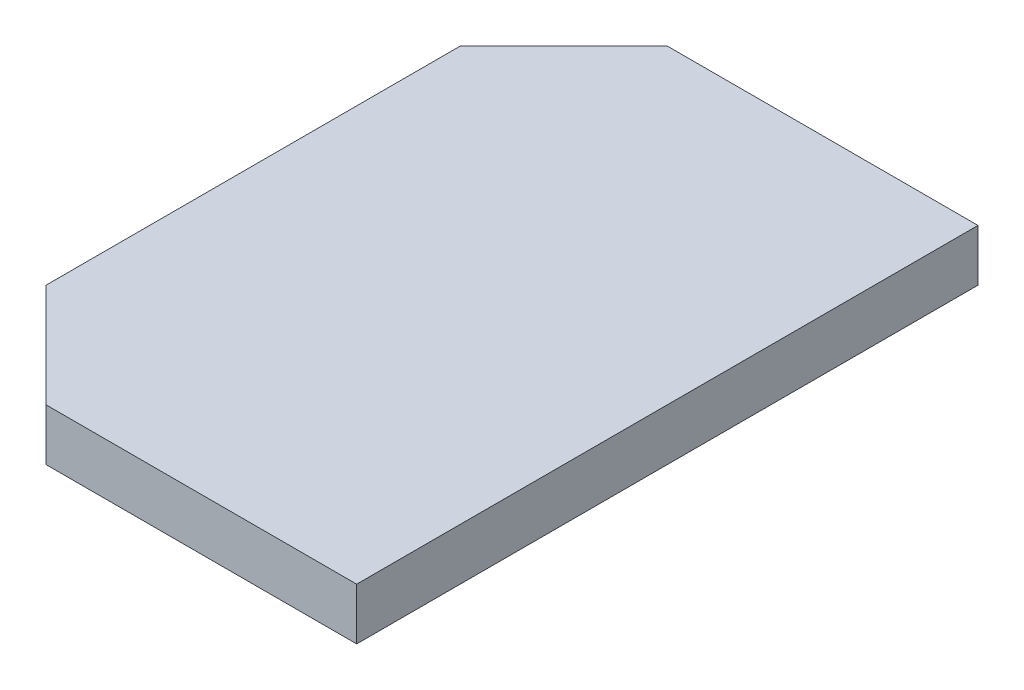
ISO-10303-21;
HEADER;
FILE_DESCRIPTION(('STEP AP214'),'2;1');
FILE_NAME('part.step','',(''),(''),'','','');
FILE_SCHEMA(('AUTOMOTIVE_DESIGN { 1 0 10303 214 1 1 1 1 }'));
ENDSEC;
DATA;
#1=APPLICATION_CONTEXT('core data for automotive mechanical design processes');
#2=APPLICATION_PROTOCOL_DEFINITION('international standard','automotive_design',2000,#1);
#3=PRODUCT_CONTEXT('',#1,'mechanical');
#4=PRODUCT('Part','Part','',(#3));
#5=PRODUCT_RELATED_PRODUCT_CATEGORY('part','',(#4));
#6=PRODUCT_DEFINITION_FORMATION('','',#4);
#7=PRODUCT_DEFINITION_CONTEXT('part definition',#1,'design');
#8=PRODUCT_DEFINITION('design','',#6,#7);
#9=PRODUCT_DEFINITION_SHAPE('','',#8);
#10=(LENGTH_UNIT() NAMED_UNIT(*) SI_UNIT(.MILLI.,.METRE.));
#11=(NAMED_UNIT(*) PLANE_ANGLE_UNIT() SI_UNIT($,.RADIAN.));
#12=(NAMED_UNIT(*) SI_UNIT($,.STERADIAN.) SOLID_ANGLE_UNIT());
#13=UNCERTAINTY_MEASURE_WITH_UNIT(LENGTH_MEASURE(1.E-05),#10,'distance_accuracy_value','');
#14=(GEOMETRIC_REPRESENTATION_CONTEXT(3) GLOBAL_UNCERTAINTY_ASSIGNED_CONTEXT((#13)) GLOBAL_UNIT_ASSIGNED_CONTEXT((#10,
#11,#12)) REPRESENTATION_CONTEXT('',''));
#15=CARTESIAN_POINT('',(0.,0.,0.));
#16=DIRECTION('',(0.,0.,1.));
#17=DIRECTION('',(1.,0.,0.));
#18=AXIS2_PLACEMENT_3D('',#15,#16,#17);
#19=CARTESIAN_POINT('',(-25.4,3.175,0.));
#20=DIRECTION('',(1.,0.,0.));
#21=DIRECTION('',(0.,0.,-1.));
#22=AXIS2_PLACEMENT_3D('',#19,#20,#21);
#23=PLANE('',#22);
#24=DIRECTION('',(0.,0.,1.));
#25=VECTOR('',#24,1.);
#26=CARTESIAN_POINT('',(-25.4,-3.175,0.));
#27=LINE('',#26,#25);
#28=CARTESIAN_POINT('',(-25.4,-3.175,-25.4));
#29=VERTEX_POINT('',#28);
#30=CARTESIAN_POINT('',(-25.4,-3.175,25.4));
#31=VERTEX_POINT('',#30);
#32=EDGE_CURVE('E122',#29,#31,#27,.T.);
#33=ORIENTED_EDGE('',*,*,#32,.T.);
#34=DIRECTION('',(0.,-1.,0.));
#35=VECTOR('',#34,1.);
#36=CARTESIAN_POINT('',(-25.4,3.175,25.4));
#37=LINE('',#36,#35);
#38=CARTESIAN_POINT('',(-25.4,3.175,25.4));
#39=VERTEX_POINT('',#38);
#40=EDGE_CURVE('E11',#39,#31,#37,.T.);
#41=ORIENTED_EDGE('',*,*,#40,.F.);
#42=DIRECTION('',(0.,0.,1.));
#43=VECTOR('',#42,1.);
#44=CARTESIAN_POINT('',(-25.4,3.175,0.));
#45=LINE('',#44,#43);
#46=CARTESIAN_POINT('',(-25.4,3.175,-25.4));
#47=VERTEX_POINT('',#46);
#48=EDGE_CURVE('E136',#47,#39,#45,.T.);
#49=ORIENTED_EDGE('',*,*,#48,.F.);
#50=DIRECTION('',(0.,-1.,0.));
#51=VECTOR('',#50,1.);
#52=CARTESIAN_POINT('',(-25.4,3.175,-25.4));
#53=LINE('',#52,#51);
#54=EDGE_CURVE('E53',#47,#29,#53,.T.);
#55=ORIENTED_EDGE('',*,*,#54,.T.);
#56=EDGE_LOOP('',(#33,#41,#49,#55));
#57=FACE_BOUND('',#56,.T.);
#58=ADVANCED_FACE('F37',(#57),#23,.F.);
#59=CARTESIAN_POINT('',(-25.4,3.175,25.4));
#60=DIRECTION('',(0.707106781186548,0.,-0.707106781186548));
#61=DIRECTION('',(-0.707106781186548,0.,-0.707106781186548));
#62=AXIS2_PLACEMENT_3D('',#59,#60,#61);
#63=PLANE('',#62);
#64=DIRECTION('',(0.707106781186548,0.,0.707106781186548));
#65=VECTOR('',#64,1.);
#66=CARTESIAN_POINT('',(-25.4,-3.175,25.4));
#67=LINE('',#66,#65);
#68=CARTESIAN_POINT('',(-12.7,-3.175,38.1));
#69=VERTEX_POINT('',#68);
#70=EDGE_CURVE('E124',#31,#69,#67,.T.);
#71=ORIENTED_EDGE('',*,*,#70,.T.);
#72=DIRECTION('',(0.,-1.,0.));
#73=VECTOR('',#72,1.);
#74=CARTESIAN_POINT('',(-12.7,3.175,38.1));
#75=LINE('',#74,#73);
#76=CARTESIAN_POINT('',(-12.7,3.175,38.1));
#77=VERTEX_POINT('',#76);
#78=EDGE_CURVE('E45',#77,#69,#75,.T.);
#79=ORIENTED_EDGE('',*,*,#78,.F.);
#80=DIRECTION('',(0.707106781186548,0.,0.707106781186548));
#81=VECTOR('',#80,1.);
#82=CARTESIAN_POINT('',(-25.4,3.175,25.4));
#83=LINE('',#82,#81);
#84=EDGE_CURVE('E86',#39,#77,#83,.T.);
#85=ORIENTED_EDGE('',*,*,#84,.F.);
#86=ORIENTED_EDGE('',*,*,#40,.T.);
#87=EDGE_LOOP('',(#71,#79,#85,#86));
#88=FACE_BOUND('',#87,.T.);
#89=ADVANCED_FACE('F142',(#88),#63,.F.);
#90=CARTESIAN_POINT('',(0.,3.175,38.1));
#91=DIRECTION('',(0.,0.,1.));
#92=DIRECTION('',(1.,0.,0.));
#93=AXIS2_PLACEMENT_3D('',#90,#91,#92);
#94=PLANE('',#93);
#95=DIRECTION('',(-1.,0.,0.));
#96=VECTOR('',#95,1.);
#97=CARTESIAN_POINT('',(0.,-3.175,38.1));
#98=LINE('',#97,#96);
#99=CARTESIAN_POINT('',(25.4,-3.175,38.1));
#100=VERTEX_POINT('',#99);
#101=EDGE_CURVE('E127',#100,#69,#98,.T.);
#102=ORIENTED_EDGE('',*,*,#101,.F.);
#103=DIRECTION('',(0.,-1.,0.));
#104=VECTOR('',#103,1.);
#105=CARTESIAN_POINT('',(25.4,3.175,38.1));
#106=LINE('',#105,#104);
#107=CARTESIAN_POINT('',(25.4,3.175,38.1));
#108=VERTEX_POINT('',#107);
#109=EDGE_CURVE('E105',#108,#100,#106,.T.);
#110=ORIENTED_EDGE('',*,*,#109,.F.);
#111=DIRECTION('',(-1.,0.,0.));
#112=VECTOR('',#111,1.);
#113=CARTESIAN_POINT('',(0.,3.175,38.1));
#114=LINE('',#113,#112);
#115=EDGE_CURVE('E116',#108,#77,#114,.T.);
#116=ORIENTED_EDGE('',*,*,#115,.T.);
#117=ORIENTED_EDGE('',*,*,#78,.T.);
#118=EDGE_LOOP('',(#102,#110,#116,#117));
#119=FACE_BOUND('',#118,.T.);
#120=ADVANCED_FACE('F141',(#119),#94,.T.);
#121=CARTESIAN_POINT('',(25.4,3.175,0.));
#122=DIRECTION('',(1.,0.,0.));
#123=DIRECTION('',(0.,0.,-1.));
#124=AXIS2_PLACEMENT_3D('',#121,#122,#123);
#125=PLANE('',#124);
#126=DIRECTION('',(0.,0.,1.));
#127=VECTOR('',#126,1.);
#128=CARTESIAN_POINT('',(25.4,-3.175,0.));
#129=LINE('',#128,#127);
#130=CARTESIAN_POINT('',(25.4,-3.175,-38.1));
#131=VERTEX_POINT('',#130);
#132=EDGE_CURVE('E102',#131,#100,#129,.T.);
#133=ORIENTED_EDGE('',*,*,#132,.F.);
#134=DIRECTION('',(0.,-1.,0.));
#135=VECTOR('',#134,1.);
#136=CARTESIAN_POINT('',(25.4,3.175,-38.1));
#137=LINE('',#136,#135);
#138=CARTESIAN_POINT('',(25.4,3.175,-38.1));
#139=VERTEX_POINT('',#138);
#140=EDGE_CURVE('E96',#139,#131,#137,.T.);
#141=ORIENTED_EDGE('',*,*,#140,.F.);
#142=DIRECTION('',(0.,0.,1.));
#143=VECTOR('',#142,1.);
#144=CARTESIAN_POINT('',(25.4,3.175,0.));
#145=LINE('',#144,#143);
#146=EDGE_CURVE('E100',#139,#108,#145,.T.);
#147=ORIENTED_EDGE('',*,*,#146,.T.);
#148=ORIENTED_EDGE('',*,*,#109,.T.);
#149=EDGE_LOOP('',(#133,#141,#147,#148));
#150=FACE_BOUND('',#149,.T.);
#151=ADVANCED_FACE('F98',(#150),#125,.T.);
#152=CARTESIAN_POINT('',(0.,3.175,-38.1));
#153=DIRECTION('',(0.,0.,1.));
#154=DIRECTION('',(1.,0.,0.));
#155=AXIS2_PLACEMENT_3D('',#152,#153,#154);
#156=PLANE('',#155);
#157=DIRECTION('',(-1.,0.,0.));
#158=VECTOR('',#157,1.);
#159=CARTESIAN_POINT('',(0.,-3.175,-38.1));
#160=LINE('',#159,#158);
#161=CARTESIAN_POINT('',(-12.7,-3.175,-38.1));
#162=VERTEX_POINT('',#161);
#163=EDGE_CURVE('E131',#131,#162,#160,.T.);
#164=ORIENTED_EDGE('',*,*,#163,.T.);
#165=DIRECTION('',(0.,-1.,0.));
#166=VECTOR('',#165,1.);
#167=CARTESIAN_POINT('',(-12.7,3.175,-38.1));
#168=LINE('',#167,#166);
#169=CARTESIAN_POINT('',(-12.7,3.175,-38.1));
#170=VERTEX_POINT('',#169);
#171=EDGE_CURVE('E74',#170,#162,#168,.T.);
#172=ORIENTED_EDGE('',*,*,#171,.F.);
#173=DIRECTION('',(-1.,0.,0.));
#174=VECTOR('',#173,1.);
#175=CARTESIAN_POINT('',(0.,3.175,-38.1));
#176=LINE('',#175,#174);
#177=EDGE_CURVE('E107',#139,#170,#176,.T.);
#178=ORIENTED_EDGE('',*,*,#177,.F.);
#179=ORIENTED_EDGE('',*,*,#140,.T.);
#180=EDGE_LOOP('',(#164,#172,#178,#179));
#181=FACE_BOUND('',#180,.T.);
#182=ADVANCED_FACE('F108',(#181),#156,.F.);
#183=CARTESIAN_POINT('',(-25.4,3.175,-25.4));
#184=DIRECTION('',(-0.707106781186548,0.,-0.707106781186548));
#185=DIRECTION('',(-0.707106781186548,0.,0.707106781186548));
#186=AXIS2_PLACEMENT_3D('',#183,#184,#185);
#187=PLANE('',#186);
#188=DIRECTION('',(0.707106781186548,0.,-0.707106781186548));
#189=VECTOR('',#188,1.);
#190=CARTESIAN_POINT('',(-25.4,-3.175,-25.4));
#191=LINE('',#190,#189);
#192=EDGE_CURVE('E133',#29,#162,#191,.T.);
#193=ORIENTED_EDGE('',*,*,#192,.F.);
#194=ORIENTED_EDGE('',*,*,#54,.F.);
#195=DIRECTION('',(0.707106781186548,0.,-0.707106781186548));
#196=VECTOR('',#195,1.);
#197=CARTESIAN_POINT('',(-25.4,3.175,-25.4));
#198=LINE('',#197,#196);
#199=EDGE_CURVE('E111',#47,#170,#198,.T.);
#200=ORIENTED_EDGE('',*,*,#199,.T.);
#201=ORIENTED_EDGE('',*,*,#171,.T.);
#202=EDGE_LOOP('',(#193,#194,#200,#201));
#203=FACE_BOUND('',#202,.T.);
#204=ADVANCED_FACE('F146',(#203),#187,.T.);
#205=CARTESIAN_POINT('',(0.,3.175,0.));
#206=DIRECTION('',(0.,1.,0.));
#207=DIRECTION('',(0.,0.,1.));
#208=AXIS2_PLACEMENT_3D('',#205,#206,#207);
#209=PLANE('',#208);
#210=ORIENTED_EDGE('',*,*,#48,.T.);
#211=ORIENTED_EDGE('',*,*,#84,.T.);
#212=ORIENTED_EDGE('',*,*,#115,.F.);
#213=ORIENTED_EDGE('',*,*,#146,.F.);
#214=ORIENTED_EDGE('',*,*,#177,.T.);
#215=ORIENTED_EDGE('',*,*,#199,.F.);
#216=EDGE_LOOP('',(#210,#211,#212,#213,#214,#215));
#217=FACE_BOUND('',#216,.T.);
#218=ADVANCED_FACE('F114',(#217),#209,.T.);
#219=CARTESIAN_POINT('',(0.,-3.175,0.));
#220=DIRECTION('',(0.,1.,0.));
#221=DIRECTION('',(0.,0.,1.));
#222=AXIS2_PLACEMENT_3D('',#219,#220,#221);
#223=PLANE('',#222);
#224=ORIENTED_EDGE('',*,*,#32,.F.);
#225=ORIENTED_EDGE('',*,*,#192,.T.);
#226=ORIENTED_EDGE('',*,*,#163,.F.);
#227=ORIENTED_EDGE('',*,*,#132,.T.);
#228=ORIENTED_EDGE('',*,*,#101,.T.);
#229=ORIENTED_EDGE('',*,*,#70,.F.);
#230=EDGE_LOOP('',(#224,#225,#226,#227,#228,#229));
#231=FACE_BOUND('',#230,.T.);
#232=ADVANCED_FACE('F145',(#231),#223,.F.);
#233=CLOSED_SHELL('',(#58,#89,#120,#151,#182,#204,#218,#232));
#234=MANIFOLD_SOLID_BREP('B2',#233);
#235=ADVANCED_BREP_SHAPE_REPRESENTATION('',(#18,#234),#14);
#236=SHAPE_DEFINITION_REPRESENTATION(#9,#235);
ENDSEC;
END-ISO-10303-21;
